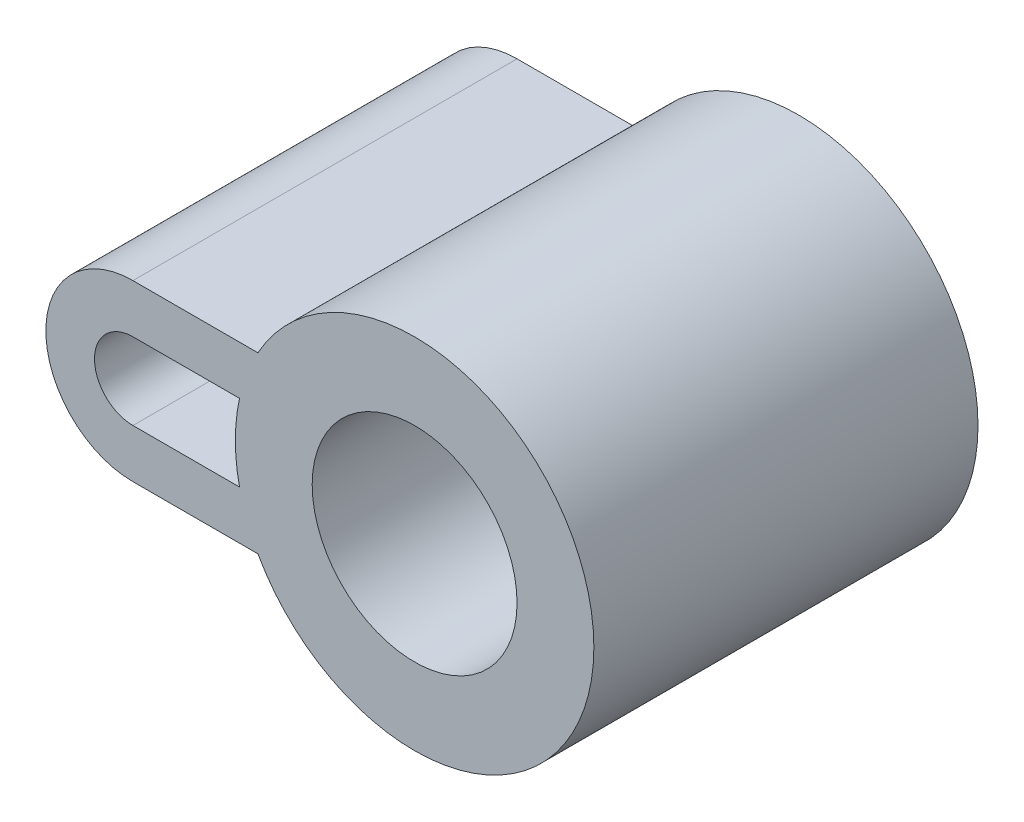
ISO-10303-21;
HEADER;
FILE_DESCRIPTION(('STEP AP214'),'2;1');
FILE_NAME('part.step','',(''),(''),'','','');
FILE_SCHEMA(('AUTOMOTIVE_DESIGN { 1 0 10303 214 1 1 1 1 }'));
ENDSEC;
DATA;
#1=APPLICATION_CONTEXT('core data for automotive mechanical design processes');
#2=APPLICATION_PROTOCOL_DEFINITION('international standard','automotive_design',2000,#1);
#3=PRODUCT_CONTEXT('',#1,'mechanical');
#4=PRODUCT('Part','Part','',(#3));
#5=PRODUCT_RELATED_PRODUCT_CATEGORY('part','',(#4));
#6=PRODUCT_DEFINITION_FORMATION('','',#4);
#7=PRODUCT_DEFINITION_CONTEXT('part definition',#1,'design');
#8=PRODUCT_DEFINITION('design','',#6,#7);
#9=PRODUCT_DEFINITION_SHAPE('','',#8);
#10=(LENGTH_UNIT() NAMED_UNIT(*) SI_UNIT(.MILLI.,.METRE.));
#11=(NAMED_UNIT(*) PLANE_ANGLE_UNIT() SI_UNIT($,.RADIAN.));
#12=(NAMED_UNIT(*) SI_UNIT($,.STERADIAN.) SOLID_ANGLE_UNIT());
#13=UNCERTAINTY_MEASURE_WITH_UNIT(LENGTH_MEASURE(1.E-05),#10,'distance_accuracy_value','');
#14=(GEOMETRIC_REPRESENTATION_CONTEXT(3) GLOBAL_UNCERTAINTY_ASSIGNED_CONTEXT((#13)) GLOBAL_UNIT_ASSIGNED_CONTEXT((#10,
#11,#12)) REPRESENTATION_CONTEXT('',''));
#15=CARTESIAN_POINT('',(0.,0.,0.));
#16=DIRECTION('',(0.,0.,1.));
#17=DIRECTION('',(1.,0.,0.));
#18=AXIS2_PLACEMENT_3D('',#15,#16,#17);
#19=CARTESIAN_POINT('',(0.,0.,75.));
#20=DIRECTION('',(0.,0.,-1.));
#21=DIRECTION('',(-1.,0.,0.));
#22=AXIS2_PLACEMENT_3D('',#19,#20,#21);
#23=CYLINDRICAL_SURFACE('',#22,35.);
#24=CARTESIAN_POINT('',(0.,0.,0.));
#25=DIRECTION('',(0.,0.,1.));
#26=DIRECTION('',(1.,0.,0.));
#27=AXIS2_PLACEMENT_3D('',#24,#25,#26);
#28=CIRCLE('',#27,35.);
#29=CARTESIAN_POINT('',(-30.5941170815567,-17.,0.));
#30=VERTEX_POINT('',#29);
#31=CARTESIAN_POINT('',(-30.5941170815567,17.,0.));
#32=VERTEX_POINT('',#31);
#33=EDGE_CURVE('E141',#30,#32,#28,.T.);
#34=ORIENTED_EDGE('',*,*,#33,.T.);
#35=DIRECTION('',(0.,0.,-1.));
#36=VECTOR('',#35,1.);
#37=CARTESIAN_POINT('',(-30.5941170815567,17.,75.));
#38=LINE('',#37,#36);
#39=CARTESIAN_POINT('',(-30.5941170815567,17.,75.));
#40=VERTEX_POINT('',#39);
#41=EDGE_CURVE('E11',#40,#32,#38,.T.);
#42=ORIENTED_EDGE('',*,*,#41,.F.);
#43=CARTESIAN_POINT('',(0.,0.,75.));
#44=DIRECTION('',(0.,0.,1.));
#45=DIRECTION('',(1.,0.,0.));
#46=AXIS2_PLACEMENT_3D('',#43,#44,#45);
#47=CIRCLE('',#46,35.);
#48=CARTESIAN_POINT('',(-30.5941170815567,-17.,75.));
#49=VERTEX_POINT('',#48);
#50=EDGE_CURVE('E120',#49,#40,#47,.T.);
#51=ORIENTED_EDGE('',*,*,#50,.F.);
#52=DIRECTION('',(0.,0.,-1.));
#53=VECTOR('',#52,1.);
#54=CARTESIAN_POINT('',(-30.5941170815567,-17.,75.));
#55=LINE('',#54,#53);
#56=EDGE_CURVE('E154',#49,#30,#55,.T.);
#57=ORIENTED_EDGE('',*,*,#56,.T.);
#58=EDGE_LOOP('',(#34,#42,#51,#57));
#59=FACE_BOUND('',#58,.T.);
#60=ADVANCED_FACE('F38',(#59),#23,.T.);
#61=CARTESIAN_POINT('',(0.,17.,75.));
#62=DIRECTION('',(0.,-1.,0.));
#63=DIRECTION('',(1.,0.,0.));
#64=AXIS2_PLACEMENT_3D('',#61,#62,#63);
#65=PLANE('',#64);
#66=DIRECTION('',(-1.,0.,0.));
#67=VECTOR('',#66,1.);
#68=CARTESIAN_POINT('',(0.,17.,0.));
#69=LINE('',#68,#67);
#70=CARTESIAN_POINT('',(-55.,17.,0.));
#71=VERTEX_POINT('',#70);
#72=EDGE_CURVE('E125',#32,#71,#69,.T.);
#73=ORIENTED_EDGE('',*,*,#72,.T.);
#74=DIRECTION('',(0.,0.,-1.));
#75=VECTOR('',#74,1.);
#76=CARTESIAN_POINT('',(-55.,17.,75.));
#77=LINE('',#76,#75);
#78=CARTESIAN_POINT('',(-55.,17.,75.));
#79=VERTEX_POINT('',#78);
#80=EDGE_CURVE('E48',#79,#71,#77,.T.);
#81=ORIENTED_EDGE('',*,*,#80,.F.);
#82=DIRECTION('',(-1.,0.,0.));
#83=VECTOR('',#82,1.);
#84=CARTESIAN_POINT('',(0.,17.,75.));
#85=LINE('',#84,#83);
#86=EDGE_CURVE('E114',#40,#79,#85,.T.);
#87=ORIENTED_EDGE('',*,*,#86,.F.);
#88=ORIENTED_EDGE('',*,*,#41,.T.);
#89=EDGE_LOOP('',(#73,#81,#87,#88));
#90=FACE_BOUND('',#89,.T.);
#91=ADVANCED_FACE('F124',(#90),#65,.F.);
#92=CARTESIAN_POINT('',(-55.,0.,75.));
#93=DIRECTION('',(0.,0.,-1.));
#94=DIRECTION('',(-1.,0.,0.));
#95=AXIS2_PLACEMENT_3D('',#92,#93,#94);
#96=CYLINDRICAL_SURFACE('',#95,17.);
#97=CARTESIAN_POINT('',(-55.,0.,0.));
#98=DIRECTION('',(0.,0.,1.));
#99=DIRECTION('',(1.,0.,0.));
#100=AXIS2_PLACEMENT_3D('',#97,#98,#99);
#101=CIRCLE('',#100,17.);
#102=CARTESIAN_POINT('',(-55.,-17.,0.));
#103=VERTEX_POINT('',#102);
#104=EDGE_CURVE('E86',#71,#103,#101,.T.);
#105=ORIENTED_EDGE('',*,*,#104,.T.);
#106=DIRECTION('',(0.,0.,-1.));
#107=VECTOR('',#106,1.);
#108=CARTESIAN_POINT('',(-55.,-17.,75.));
#109=LINE('',#108,#107);
#110=CARTESIAN_POINT('',(-55.,-17.,75.));
#111=VERTEX_POINT('',#110);
#112=EDGE_CURVE('E126',#111,#103,#109,.T.);
#113=ORIENTED_EDGE('',*,*,#112,.F.);
#114=CARTESIAN_POINT('',(-55.,0.,75.));
#115=DIRECTION('',(0.,0.,1.));
#116=DIRECTION('',(1.,0.,0.));
#117=AXIS2_PLACEMENT_3D('',#114,#115,#116);
#118=CIRCLE('',#117,17.);
#119=EDGE_CURVE('E118',#79,#111,#118,.T.);
#120=ORIENTED_EDGE('',*,*,#119,.F.);
#121=ORIENTED_EDGE('',*,*,#80,.T.);
#122=EDGE_LOOP('',(#105,#113,#120,#121));
#123=FACE_BOUND('',#122,.T.);
#124=ADVANCED_FACE('F128',(#123),#96,.T.);
#125=CARTESIAN_POINT('',(0.,7.5,75.));
#126=DIRECTION('',(0.,1.,0.));
#127=DIRECTION('',(0.,0.,1.));
#128=AXIS2_PLACEMENT_3D('',#125,#126,#127);
#129=PLANE('',#128);
#130=DIRECTION('',(1.,0.,0.));
#131=VECTOR('',#130,1.);
#132=CARTESIAN_POINT('',(0.,7.5,0.));
#133=LINE('',#132,#131);
#134=CARTESIAN_POINT('',(-55.,7.5,0.));
#135=VERTEX_POINT('',#134);
#136=CARTESIAN_POINT('',(-34.1869858279434,7.5,0.));
#137=VERTEX_POINT('',#136);
#138=EDGE_CURVE('E134',#135,#137,#133,.T.);
#139=ORIENTED_EDGE('',*,*,#138,.T.);
#140=DIRECTION('',(0.,0.,-1.));
#141=VECTOR('',#140,1.);
#142=CARTESIAN_POINT('',(-34.1869858279434,7.5,75.));
#143=LINE('',#142,#141);
#144=CARTESIAN_POINT('',(-34.1869858279434,7.5,75.));
#145=VERTEX_POINT('',#144);
#146=EDGE_CURVE('E42',#145,#137,#143,.T.);
#147=ORIENTED_EDGE('',*,*,#146,.F.);
#148=DIRECTION('',(1.,0.,0.));
#149=VECTOR('',#148,1.);
#150=CARTESIAN_POINT('',(0.,7.5,75.));
#151=LINE('',#150,#149);
#152=CARTESIAN_POINT('',(-55.,7.5,75.));
#153=VERTEX_POINT('',#152);
#154=EDGE_CURVE('E153',#153,#145,#151,.T.);
#155=ORIENTED_EDGE('',*,*,#154,.F.);
#156=DIRECTION('',(0.,0.,-1.));
#157=VECTOR('',#156,1.);
#158=CARTESIAN_POINT('',(-55.,7.5,75.));
#159=LINE('',#158,#157);
#160=EDGE_CURVE('E130',#153,#135,#159,.T.);
#161=ORIENTED_EDGE('',*,*,#160,.T.);
#162=EDGE_LOOP('',(#139,#147,#155,#161));
#163=FACE_BOUND('',#162,.T.);
#164=ADVANCED_FACE('F40',(#163),#129,.F.);
#165=CARTESIAN_POINT('',(-34.1869858279434,-7.5,0.));
#166=VERTEX_POINT('',#165);
#167=EDGE_CURVE('E137',#137,#166,#28,.T.);
#168=ORIENTED_EDGE('',*,*,#167,.T.);
#169=DIRECTION('',(0.,0.,-1.));
#170=VECTOR('',#169,1.);
#171=CARTESIAN_POINT('',(-34.1869858279434,-7.5,75.));
#172=LINE('',#171,#170);
#173=CARTESIAN_POINT('',(-34.1869858279434,-7.5,75.));
#174=VERTEX_POINT('',#173);
#175=EDGE_CURVE('E159',#174,#166,#172,.T.);
#176=ORIENTED_EDGE('',*,*,#175,.F.);
#177=EDGE_CURVE('E101',#145,#174,#47,.T.);
#178=ORIENTED_EDGE('',*,*,#177,.F.);
#179=ORIENTED_EDGE('',*,*,#146,.T.);
#180=EDGE_LOOP('',(#168,#176,#178,#179));
#181=FACE_BOUND('',#180,.T.);
#182=ADVANCED_FACE('F164',(#181),#23,.T.);
#183=CARTESIAN_POINT('',(0.,-7.5,75.));
#184=DIRECTION('',(0.,1.,0.));
#185=DIRECTION('',(0.,0.,1.));
#186=AXIS2_PLACEMENT_3D('',#183,#184,#185);
#187=PLANE('',#186);
#188=DIRECTION('',(1.,0.,0.));
#189=VECTOR('',#188,1.);
#190=CARTESIAN_POINT('',(0.,-7.5,0.));
#191=LINE('',#190,#189);
#192=CARTESIAN_POINT('',(-55.,-7.5,0.));
#193=VERTEX_POINT('',#192);
#194=EDGE_CURVE('E140',#193,#166,#191,.T.);
#195=ORIENTED_EDGE('',*,*,#194,.F.);
#196=DIRECTION('',(0.,0.,-1.));
#197=VECTOR('',#196,1.);
#198=CARTESIAN_POINT('',(-55.,-7.5,75.));
#199=LINE('',#198,#197);
#200=CARTESIAN_POINT('',(-55.,-7.5,75.));
#201=VERTEX_POINT('',#200);
#202=EDGE_CURVE('E158',#201,#193,#199,.T.);
#203=ORIENTED_EDGE('',*,*,#202,.F.);
#204=DIRECTION('',(1.,0.,0.));
#205=VECTOR('',#204,1.);
#206=CARTESIAN_POINT('',(0.,-7.5,75.));
#207=LINE('',#206,#205);
#208=EDGE_CURVE('E303',#201,#174,#207,.T.);
#209=ORIENTED_EDGE('',*,*,#208,.T.);
#210=ORIENTED_EDGE('',*,*,#175,.T.);
#211=EDGE_LOOP('',(#195,#203,#209,#210));
#212=FACE_BOUND('',#211,.T.);
#213=ADVANCED_FACE('F178',(#212),#187,.T.);
#214=CARTESIAN_POINT('',(0.,0.,75.));
#215=DIRECTION('',(0.,0.,-1.));
#216=DIRECTION('',(-1.,0.,0.));
#217=AXIS2_PLACEMENT_3D('',#214,#215,#216);
#218=CYLINDRICAL_SURFACE('',#217,20.);
#219=CARTESIAN_POINT('',(0.,0.,75.));
#220=DIRECTION('',(0.,0.,1.));
#221=DIRECTION('',(1.,0.,0.));
#222=AXIS2_PLACEMENT_3D('',#219,#220,#221);
#223=CIRCLE('',#222,20.);
#224=CARTESIAN_POINT('',(20.,0.,75.));
#225=VERTEX_POINT('',#224);
#226=EDGE_CURVE('E301',#225,#225,#223,.T.);
#227=ORIENTED_EDGE('',*,*,#226,.T.);
#228=EDGE_LOOP('',(#227));
#229=FACE_BOUND('',#228,.T.);
#230=CARTESIAN_POINT('',(0.,0.,0.));
#231=DIRECTION('',(0.,0.,1.));
#232=DIRECTION('',(1.,0.,0.));
#233=AXIS2_PLACEMENT_3D('',#230,#231,#232);
#234=CIRCLE('',#233,20.);
#235=CARTESIAN_POINT('',(20.,0.,0.));
#236=VERTEX_POINT('',#235);
#237=EDGE_CURVE('E147',#236,#236,#234,.T.);
#238=ORIENTED_EDGE('',*,*,#237,.F.);
#239=EDGE_LOOP('',(#238));
#240=FACE_BOUND('',#239,.T.);
#241=ADVANCED_FACE('F180',(#229,#240),#218,.F.);
#242=CARTESIAN_POINT('',(-55.,0.,75.));
#243=DIRECTION('',(0.,0.,-1.));
#244=DIRECTION('',(-1.,0.,0.));
#245=AXIS2_PLACEMENT_3D('',#242,#243,#244);
#246=CYLINDRICAL_SURFACE('',#245,7.5);
#247=CARTESIAN_POINT('',(-55.,0.,0.));
#248=DIRECTION('',(0.,0.,1.));
#249=DIRECTION('',(1.,0.,0.));
#250=AXIS2_PLACEMENT_3D('',#247,#248,#249);
#251=CIRCLE('',#250,7.5);
#252=EDGE_CURVE('E144',#135,#193,#251,.T.);
#253=ORIENTED_EDGE('',*,*,#252,.F.);
#254=ORIENTED_EDGE('',*,*,#160,.F.);
#255=CARTESIAN_POINT('',(-55.,0.,75.));
#256=DIRECTION('',(0.,0.,1.));
#257=DIRECTION('',(1.,0.,0.));
#258=AXIS2_PLACEMENT_3D('',#255,#256,#257);
#259=CIRCLE('',#258,7.5);
#260=EDGE_CURVE('E176',#153,#201,#259,.T.);
#261=ORIENTED_EDGE('',*,*,#260,.T.);
#262=ORIENTED_EDGE('',*,*,#202,.T.);
#263=EDGE_LOOP('',(#253,#254,#261,#262));
#264=FACE_BOUND('',#263,.T.);
#265=ADVANCED_FACE('F173',(#264),#246,.F.);
#266=CARTESIAN_POINT('',(0.,-17.,75.));
#267=DIRECTION('',(0.,1.,0.));
#268=DIRECTION('',(-1.,0.,0.));
#269=AXIS2_PLACEMENT_3D('',#266,#267,#268);
#270=PLANE('',#269);
#271=DIRECTION('',(1.,0.,0.));
#272=VECTOR('',#271,1.);
#273=CARTESIAN_POINT('',(0.,-17.,0.));
#274=LINE('',#273,#272);
#275=EDGE_CURVE('E92',#103,#30,#274,.T.);
#276=ORIENTED_EDGE('',*,*,#275,.T.);
#277=ORIENTED_EDGE('',*,*,#56,.F.);
#278=DIRECTION('',(1.,0.,0.));
#279=VECTOR('',#278,1.);
#280=CARTESIAN_POINT('',(0.,-17.,75.));
#281=LINE('',#280,#279);
#282=EDGE_CURVE('E57',#111,#49,#281,.T.);
#283=ORIENTED_EDGE('',*,*,#282,.F.);
#284=ORIENTED_EDGE('',*,*,#112,.T.);
#285=EDGE_LOOP('',(#276,#277,#283,#284));
#286=FACE_BOUND('',#285,.T.);
#287=ADVANCED_FACE('F198',(#286),#270,.F.);
#288=CARTESIAN_POINT('',(0.,0.,75.));
#289=DIRECTION('',(0.,0.,1.));
#290=DIRECTION('',(1.,0.,0.));
#291=AXIS2_PLACEMENT_3D('',#288,#289,#290);
#292=PLANE('',#291);
#293=ORIENTED_EDGE('',*,*,#154,.T.);
#294=ORIENTED_EDGE('',*,*,#177,.T.);
#295=ORIENTED_EDGE('',*,*,#208,.F.);
#296=ORIENTED_EDGE('',*,*,#260,.F.);
#297=EDGE_LOOP('',(#293,#294,#295,#296));
#298=FACE_BOUND('',#297,.T.);
#299=ORIENTED_EDGE('',*,*,#226,.F.);
#300=EDGE_LOOP('',(#299));
#301=FACE_BOUND('',#300,.T.);
#302=ORIENTED_EDGE('',*,*,#50,.T.);
#303=ORIENTED_EDGE('',*,*,#86,.T.);
#304=ORIENTED_EDGE('',*,*,#119,.T.);
#305=ORIENTED_EDGE('',*,*,#282,.T.);
#306=EDGE_LOOP('',(#302,#303,#304,#305));
#307=FACE_BOUND('',#306,.T.);
#308=ADVANCED_FACE('F116',(#298,#301,#307),#292,.T.);
#309=CARTESIAN_POINT('',(0.,0.,0.));
#310=DIRECTION('',(0.,0.,1.));
#311=DIRECTION('',(1.,0.,0.));
#312=AXIS2_PLACEMENT_3D('',#309,#310,#311);
#313=PLANE('',#312);
#314=ORIENTED_EDGE('',*,*,#138,.F.);
#315=ORIENTED_EDGE('',*,*,#252,.T.);
#316=ORIENTED_EDGE('',*,*,#194,.T.);
#317=ORIENTED_EDGE('',*,*,#167,.F.);
#318=EDGE_LOOP('',(#314,#315,#316,#317));
#319=FACE_BOUND('',#318,.T.);
#320=ORIENTED_EDGE('',*,*,#237,.T.);
#321=EDGE_LOOP('',(#320));
#322=FACE_BOUND('',#321,.T.);
#323=ORIENTED_EDGE('',*,*,#33,.F.);
#324=ORIENTED_EDGE('',*,*,#275,.F.);
#325=ORIENTED_EDGE('',*,*,#104,.F.);
#326=ORIENTED_EDGE('',*,*,#72,.F.);
#327=EDGE_LOOP('',(#323,#324,#325,#326));
#328=FACE_BOUND('',#327,.T.);
#329=ADVANCED_FACE('F170',(#319,#322,#328),#313,.F.);
#330=CLOSED_SHELL('',(#60,#91,#124,#164,#182,#213,#241,#265,#287,#308,#329));
#331=MANIFOLD_SOLID_BREP('B2',#330);
#332=ADVANCED_BREP_SHAPE_REPRESENTATION('',(#18,#331),#14);
#333=SHAPE_DEFINITION_REPRESENTATION(#9,#332);
ENDSEC;
END-ISO-10303-21;
